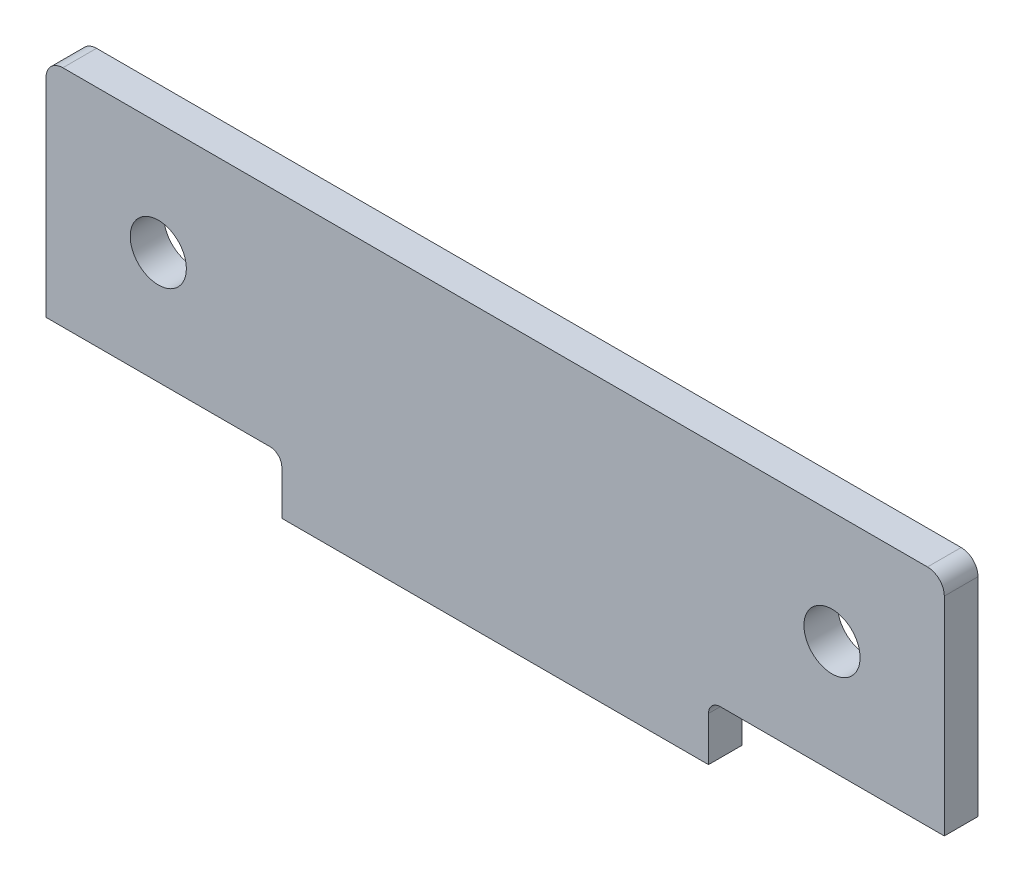
ISO-10303-21;
HEADER;
FILE_DESCRIPTION(('STEP AP214'),'2;1');
FILE_NAME('part.step','',(''),(''),'','','');
FILE_SCHEMA(('AUTOMOTIVE_DESIGN { 1 0 10303 214 1 1 1 1 }'));
ENDSEC;
DATA;
#1=APPLICATION_CONTEXT('core data for automotive mechanical design processes');
#2=APPLICATION_PROTOCOL_DEFINITION('international standard','automotive_design',2000,#1);
#3=PRODUCT_CONTEXT('',#1,'mechanical');
#4=PRODUCT('Part','Part','',(#3));
#5=PRODUCT_RELATED_PRODUCT_CATEGORY('part','',(#4));
#6=PRODUCT_DEFINITION_FORMATION('','',#4);
#7=PRODUCT_DEFINITION_CONTEXT('part definition',#1,'design');
#8=PRODUCT_DEFINITION('design','',#6,#7);
#9=PRODUCT_DEFINITION_SHAPE('','',#8);
#10=(LENGTH_UNIT() NAMED_UNIT(*) SI_UNIT(.MILLI.,.METRE.));
#11=(NAMED_UNIT(*) PLANE_ANGLE_UNIT() SI_UNIT($,.RADIAN.));
#12=(NAMED_UNIT(*) SI_UNIT($,.STERADIAN.) SOLID_ANGLE_UNIT());
#13=UNCERTAINTY_MEASURE_WITH_UNIT(LENGTH_MEASURE(1.E-05),#10,'distance_accuracy_value','');
#14=(GEOMETRIC_REPRESENTATION_CONTEXT(3) GLOBAL_UNCERTAINTY_ASSIGNED_CONTEXT((#13)) GLOBAL_UNIT_ASSIGNED_CONTEXT((#10,
#11,#12)) REPRESENTATION_CONTEXT('',''));
#15=CARTESIAN_POINT('',(0.,0.,0.));
#16=DIRECTION('',(0.,0.,1.));
#17=DIRECTION('',(1.,0.,0.));
#18=AXIS2_PLACEMENT_3D('',#15,#16,#17);
#19=CARTESIAN_POINT('',(0.,0.,3.));
#20=DIRECTION('',(0.,0.,1.));
#21=DIRECTION('',(1.,0.,0.));
#22=AXIS2_PLACEMENT_3D('',#19,#20,#21);
#23=PLANE('',#22);
#24=CARTESIAN_POINT('',(-30.,15.,3.));
#25=DIRECTION('',(0.,0.,1.));
#26=DIRECTION('',(1.,0.,0.));
#27=AXIS2_PLACEMENT_3D('',#24,#25,#26);
#28=CIRCLE('',#27,2.5);
#29=CARTESIAN_POINT('',(-27.5,15.,3.));
#30=VERTEX_POINT('',#29);
#31=EDGE_CURVE('E269',#30,#30,#28,.T.);
#32=ORIENTED_EDGE('',*,*,#31,.F.);
#33=EDGE_LOOP('',(#32));
#34=FACE_BOUND('',#33,.T.);
#35=DIRECTION('',(0.,1.,0.));
#36=VECTOR('',#35,1.);
#37=CARTESIAN_POINT('',(40.,25.,3.));
#38=LINE('',#37,#36);
#39=CARTESIAN_POINT('',(40.,5.,3.));
#40=VERTEX_POINT('',#39);
#41=CARTESIAN_POINT('',(40.,23.5,3.));
#42=VERTEX_POINT('',#41);
#43=EDGE_CURVE('E210',#40,#42,#38,.T.);
#44=ORIENTED_EDGE('',*,*,#43,.T.);
#45=CARTESIAN_POINT('',(38.5,23.5,3.));
#46=DIRECTION('',(0.,0.,1.));
#47=DIRECTION('',(1.,0.,0.));
#48=AXIS2_PLACEMENT_3D('',#45,#46,#47);
#49=CIRCLE('',#48,1.5);
#50=CARTESIAN_POINT('',(38.5,25.,3.));
#51=VERTEX_POINT('',#50);
#52=EDGE_CURVE('E47',#42,#51,#49,.T.);
#53=ORIENTED_EDGE('',*,*,#52,.T.);
#54=DIRECTION('',(-1.,0.,0.));
#55=VECTOR('',#54,1.);
#56=CARTESIAN_POINT('',(40.,25.,3.));
#57=LINE('',#56,#55);
#58=CARTESIAN_POINT('',(-38.5,25.,3.));
#59=VERTEX_POINT('',#58);
#60=EDGE_CURVE('E209',#51,#59,#57,.T.);
#61=ORIENTED_EDGE('',*,*,#60,.T.);
#62=CARTESIAN_POINT('',(-38.5,23.5,3.));
#63=DIRECTION('',(0.,0.,1.));
#64=DIRECTION('',(1.,0.,0.));
#65=AXIS2_PLACEMENT_3D('',#62,#63,#64);
#66=CIRCLE('',#65,1.5);
#67=CARTESIAN_POINT('',(-40.,23.5,3.));
#68=VERTEX_POINT('',#67);
#69=EDGE_CURVE('E54',#59,#68,#66,.T.);
#70=ORIENTED_EDGE('',*,*,#69,.T.);
#71=DIRECTION('',(0.,-1.,0.));
#72=VECTOR('',#71,1.);
#73=CARTESIAN_POINT('',(-40.,25.,3.));
#74=LINE('',#73,#72);
#75=CARTESIAN_POINT('',(-40.,5.,3.));
#76=VERTEX_POINT('',#75);
#77=EDGE_CURVE('E219',#68,#76,#74,.T.);
#78=ORIENTED_EDGE('',*,*,#77,.T.);
#79=DIRECTION('',(1.,0.,0.));
#80=VECTOR('',#79,1.);
#81=CARTESIAN_POINT('',(-40.,5.,3.));
#82=LINE('',#81,#80);
#83=CARTESIAN_POINT('',(-20.05,5.,3.));
#84=VERTEX_POINT('',#83);
#85=EDGE_CURVE('E251',#76,#84,#82,.T.);
#86=ORIENTED_EDGE('',*,*,#85,.T.);
#87=CARTESIAN_POINT('',(-20.05,3.95,3.));
#88=DIRECTION('',(0.,0.,1.));
#89=DIRECTION('',(1.,0.,0.));
#90=AXIS2_PLACEMENT_3D('',#87,#88,#89);
#91=CIRCLE('',#90,1.05);
#92=CARTESIAN_POINT('',(-19.,3.95,3.));
#93=VERTEX_POINT('',#92);
#94=EDGE_CURVE('E137',#84,#93,#91,.F.);
#95=ORIENTED_EDGE('',*,*,#94,.T.);
#96=DIRECTION('',(0.,-1.,0.));
#97=VECTOR('',#96,1.);
#98=CARTESIAN_POINT('',(-19.,5.,3.));
#99=LINE('',#98,#97);
#100=CARTESIAN_POINT('',(-19.,0.,3.));
#101=VERTEX_POINT('',#100);
#102=EDGE_CURVE('E129',#93,#101,#99,.T.);
#103=ORIENTED_EDGE('',*,*,#102,.T.);
#104=DIRECTION('',(1.,0.,0.));
#105=VECTOR('',#104,1.);
#106=CARTESIAN_POINT('',(-19.,0.,3.));
#107=LINE('',#106,#105);
#108=CARTESIAN_POINT('',(19.,0.,3.));
#109=VERTEX_POINT('',#108);
#110=EDGE_CURVE('E133',#101,#109,#107,.T.);
#111=ORIENTED_EDGE('',*,*,#110,.T.);
#112=DIRECTION('',(0.,1.,0.));
#113=VECTOR('',#112,1.);
#114=CARTESIAN_POINT('',(19.,5.,3.));
#115=LINE('',#114,#113);
#116=CARTESIAN_POINT('',(19.,3.95,3.));
#117=VERTEX_POINT('',#116);
#118=EDGE_CURVE('E153',#109,#117,#115,.T.);
#119=ORIENTED_EDGE('',*,*,#118,.T.);
#120=CARTESIAN_POINT('',(20.05,3.95,3.));
#121=DIRECTION('',(0.,0.,1.));
#122=DIRECTION('',(1.,0.,0.));
#123=AXIS2_PLACEMENT_3D('',#120,#121,#122);
#124=CIRCLE('',#123,1.05);
#125=CARTESIAN_POINT('',(20.05,5.,3.));
#126=VERTEX_POINT('',#125);
#127=EDGE_CURVE('E182',#117,#126,#124,.F.);
#128=ORIENTED_EDGE('',*,*,#127,.T.);
#129=DIRECTION('',(1.,0.,0.));
#130=VECTOR('',#129,1.);
#131=CARTESIAN_POINT('',(40.,5.,3.));
#132=LINE('',#131,#130);
#133=EDGE_CURVE('E259',#126,#40,#132,.T.);
#134=ORIENTED_EDGE('',*,*,#133,.T.);
#135=EDGE_LOOP('',(#44,#53,#61,#70,#78,#86,#95,#103,#111,#119,#128,#134));
#136=FACE_BOUND('',#135,.T.);
#137=CARTESIAN_POINT('',(30.,15.,3.));
#138=DIRECTION('',(0.,0.,1.));
#139=DIRECTION('',(-1.,0.,0.));
#140=AXIS2_PLACEMENT_3D('',#137,#138,#139);
#141=CIRCLE('',#140,2.5);
#142=CARTESIAN_POINT('',(27.5,15.,3.));
#143=VERTEX_POINT('',#142);
#144=EDGE_CURVE('E414',#143,#143,#141,.T.);
#145=ORIENTED_EDGE('',*,*,#144,.F.);
#146=EDGE_LOOP('',(#145));
#147=FACE_BOUND('',#146,.T.);
#148=ADVANCED_FACE('F38',(#34,#136,#147),#23,.T.);
#149=CARTESIAN_POINT('',(0.,0.,0.));
#150=DIRECTION('',(0.,0.,1.));
#151=DIRECTION('',(1.,0.,0.));
#152=AXIS2_PLACEMENT_3D('',#149,#150,#151);
#153=PLANE('',#152);
#154=DIRECTION('',(-1.,0.,0.));
#155=VECTOR('',#154,1.);
#156=CARTESIAN_POINT('',(40.,25.,0.));
#157=LINE('',#156,#155);
#158=CARTESIAN_POINT('',(38.5,25.,0.));
#159=VERTEX_POINT('',#158);
#160=CARTESIAN_POINT('',(-38.5,25.,0.));
#161=VERTEX_POINT('',#160);
#162=EDGE_CURVE('E228',#159,#161,#157,.T.);
#163=ORIENTED_EDGE('',*,*,#162,.F.);
#164=CARTESIAN_POINT('',(38.5,23.5,0.));
#165=DIRECTION('',(0.,0.,1.));
#166=DIRECTION('',(1.,0.,0.));
#167=AXIS2_PLACEMENT_3D('',#164,#165,#166);
#168=CIRCLE('',#167,1.5);
#169=CARTESIAN_POINT('',(40.,23.5,0.));
#170=VERTEX_POINT('',#169);
#171=EDGE_CURVE('E200',#159,#170,#168,.F.);
#172=ORIENTED_EDGE('',*,*,#171,.T.);
#173=DIRECTION('',(0.,1.,0.));
#174=VECTOR('',#173,1.);
#175=CARTESIAN_POINT('',(40.,25.,0.));
#176=LINE('',#175,#174);
#177=CARTESIAN_POINT('',(40.,5.,0.));
#178=VERTEX_POINT('',#177);
#179=EDGE_CURVE('E227',#178,#170,#176,.T.);
#180=ORIENTED_EDGE('',*,*,#179,.F.);
#181=DIRECTION('',(1.,0.,0.));
#182=VECTOR('',#181,1.);
#183=CARTESIAN_POINT('',(40.,5.,0.));
#184=LINE('',#183,#182);
#185=CARTESIAN_POINT('',(20.05,5.,0.));
#186=VERTEX_POINT('',#185);
#187=EDGE_CURVE('E233',#186,#178,#184,.T.);
#188=ORIENTED_EDGE('',*,*,#187,.F.);
#189=CARTESIAN_POINT('',(20.05,3.95,0.));
#190=DIRECTION('',(0.,0.,1.));
#191=DIRECTION('',(1.,0.,0.));
#192=AXIS2_PLACEMENT_3D('',#189,#190,#191);
#193=CIRCLE('',#192,1.05);
#194=CARTESIAN_POINT('',(19.,3.95,0.));
#195=VERTEX_POINT('',#194);
#196=EDGE_CURVE('E179',#186,#195,#193,.T.);
#197=ORIENTED_EDGE('',*,*,#196,.T.);
#198=DIRECTION('',(0.,1.,0.));
#199=VECTOR('',#198,1.);
#200=CARTESIAN_POINT('',(19.,5.,0.));
#201=LINE('',#200,#199);
#202=CARTESIAN_POINT('',(19.,0.,0.));
#203=VERTEX_POINT('',#202);
#204=EDGE_CURVE('E239',#203,#195,#201,.T.);
#205=ORIENTED_EDGE('',*,*,#204,.F.);
#206=DIRECTION('',(1.,0.,0.));
#207=VECTOR('',#206,1.);
#208=CARTESIAN_POINT('',(-19.,0.,0.));
#209=LINE('',#208,#207);
#210=CARTESIAN_POINT('',(-19.,0.,0.));
#211=VERTEX_POINT('',#210);
#212=EDGE_CURVE('E268',#211,#203,#209,.T.);
#213=ORIENTED_EDGE('',*,*,#212,.F.);
#214=DIRECTION('',(0.,-1.,0.));
#215=VECTOR('',#214,1.);
#216=CARTESIAN_POINT('',(-19.,5.,0.));
#217=LINE('',#216,#215);
#218=CARTESIAN_POINT('',(-19.,3.95,0.));
#219=VERTEX_POINT('',#218);
#220=EDGE_CURVE('E157',#219,#211,#217,.T.);
#221=ORIENTED_EDGE('',*,*,#220,.F.);
#222=CARTESIAN_POINT('',(-20.05,3.95,0.));
#223=DIRECTION('',(0.,0.,1.));
#224=DIRECTION('',(1.,0.,0.));
#225=AXIS2_PLACEMENT_3D('',#222,#223,#224);
#226=CIRCLE('',#225,1.05);
#227=CARTESIAN_POINT('',(-20.05,5.,0.));
#228=VERTEX_POINT('',#227);
#229=EDGE_CURVE('E185',#219,#228,#226,.T.);
#230=ORIENTED_EDGE('',*,*,#229,.T.);
#231=DIRECTION('',(1.,0.,0.));
#232=VECTOR('',#231,1.);
#233=CARTESIAN_POINT('',(-40.,5.,0.));
#234=LINE('',#233,#232);
#235=CARTESIAN_POINT('',(-40.,5.,0.));
#236=VERTEX_POINT('',#235);
#237=EDGE_CURVE('E143',#236,#228,#234,.T.);
#238=ORIENTED_EDGE('',*,*,#237,.F.);
#239=DIRECTION('',(0.,-1.,0.));
#240=VECTOR('',#239,1.);
#241=CARTESIAN_POINT('',(-40.,25.,0.));
#242=LINE('',#241,#240);
#243=CARTESIAN_POINT('',(-40.,23.5,0.));
#244=VERTEX_POINT('',#243);
#245=EDGE_CURVE('E237',#244,#236,#242,.T.);
#246=ORIENTED_EDGE('',*,*,#245,.F.);
#247=CARTESIAN_POINT('',(-38.5,23.5,0.));
#248=DIRECTION('',(0.,0.,1.));
#249=DIRECTION('',(1.,0.,0.));
#250=AXIS2_PLACEMENT_3D('',#247,#248,#249);
#251=CIRCLE('',#250,1.5);
#252=EDGE_CURVE('E197',#244,#161,#251,.F.);
#253=ORIENTED_EDGE('',*,*,#252,.T.);
#254=EDGE_LOOP('',(#163,#172,#180,#188,#197,#205,#213,#221,#230,#238,#246,#253));
#255=FACE_BOUND('',#254,.T.);
#256=CARTESIAN_POINT('',(-30.,15.,0.));
#257=DIRECTION('',(0.,0.,1.));
#258=DIRECTION('',(1.,0.,0.));
#259=AXIS2_PLACEMENT_3D('',#256,#257,#258);
#260=CIRCLE('',#259,2.5);
#261=CARTESIAN_POINT('',(-27.5,15.,0.));
#262=VERTEX_POINT('',#261);
#263=EDGE_CURVE('E412',#262,#262,#260,.T.);
#264=ORIENTED_EDGE('',*,*,#263,.T.);
#265=EDGE_LOOP('',(#264));
#266=FACE_BOUND('',#265,.T.);
#267=CARTESIAN_POINT('',(30.,15.,0.));
#268=DIRECTION('',(0.,0.,1.));
#269=DIRECTION('',(-1.,0.,0.));
#270=AXIS2_PLACEMENT_3D('',#267,#268,#269);
#271=CIRCLE('',#270,2.5);
#272=CARTESIAN_POINT('',(27.5,15.,0.));
#273=VERTEX_POINT('',#272);
#274=EDGE_CURVE('E420',#273,#273,#271,.T.);
#275=ORIENTED_EDGE('',*,*,#274,.T.);
#276=EDGE_LOOP('',(#275));
#277=FACE_BOUND('',#276,.T.);
#278=ADVANCED_FACE('F224',(#255,#266,#277),#153,.F.);
#279=CARTESIAN_POINT('',(-19.,5.,3.));
#280=DIRECTION('',(1.,0.,0.));
#281=DIRECTION('',(0.,0.,-1.));
#282=AXIS2_PLACEMENT_3D('',#279,#280,#281);
#283=PLANE('',#282);
#284=ORIENTED_EDGE('',*,*,#102,.F.);
#285=DIRECTION('',(0.,0.,-1.));
#286=VECTOR('',#285,1.);
#287=CARTESIAN_POINT('',(-19.,3.95,0.));
#288=LINE('',#287,#286);
#289=EDGE_CURVE('E173',#93,#219,#288,.T.);
#290=ORIENTED_EDGE('',*,*,#289,.T.);
#291=ORIENTED_EDGE('',*,*,#220,.T.);
#292=DIRECTION('',(0.,0.,-1.));
#293=VECTOR('',#292,1.);
#294=CARTESIAN_POINT('',(-19.,0.,3.));
#295=LINE('',#294,#293);
#296=EDGE_CURVE('E148',#101,#211,#295,.T.);
#297=ORIENTED_EDGE('',*,*,#296,.F.);
#298=EDGE_LOOP('',(#284,#290,#291,#297));
#299=FACE_BOUND('',#298,.T.);
#300=ADVANCED_FACE('F155',(#299),#283,.F.);
#301=CARTESIAN_POINT('',(-19.,0.,3.));
#302=DIRECTION('',(0.,1.,0.));
#303=DIRECTION('',(0.,0.,1.));
#304=AXIS2_PLACEMENT_3D('',#301,#302,#303);
#305=PLANE('',#304);
#306=ORIENTED_EDGE('',*,*,#212,.T.);
#307=DIRECTION('',(0.,0.,-1.));
#308=VECTOR('',#307,1.);
#309=CARTESIAN_POINT('',(19.,0.,3.));
#310=LINE('',#309,#308);
#311=EDGE_CURVE('E150',#109,#203,#310,.T.);
#312=ORIENTED_EDGE('',*,*,#311,.F.);
#313=ORIENTED_EDGE('',*,*,#110,.F.);
#314=ORIENTED_EDGE('',*,*,#296,.T.);
#315=EDGE_LOOP('',(#306,#312,#313,#314));
#316=FACE_BOUND('',#315,.T.);
#317=ADVANCED_FACE('F147',(#316),#305,.F.);
#318=CARTESIAN_POINT('',(19.,5.,3.));
#319=DIRECTION('',(-1.,0.,0.));
#320=DIRECTION('',(0.,0.,1.));
#321=AXIS2_PLACEMENT_3D('',#318,#319,#320);
#322=PLANE('',#321);
#323=ORIENTED_EDGE('',*,*,#204,.T.);
#324=DIRECTION('',(0.,0.,-1.));
#325=VECTOR('',#324,1.);
#326=CARTESIAN_POINT('',(19.,3.95,3.));
#327=LINE('',#326,#325);
#328=EDGE_CURVE('E165',#195,#117,#327,.F.);
#329=ORIENTED_EDGE('',*,*,#328,.T.);
#330=ORIENTED_EDGE('',*,*,#118,.F.);
#331=ORIENTED_EDGE('',*,*,#311,.T.);
#332=EDGE_LOOP('',(#323,#329,#330,#331));
#333=FACE_BOUND('',#332,.T.);
#334=ADVANCED_FACE('F276',(#333),#322,.F.);
#335=CARTESIAN_POINT('',(40.,5.,3.));
#336=DIRECTION('',(0.,1.,0.));
#337=DIRECTION('',(0.,0.,1.));
#338=AXIS2_PLACEMENT_3D('',#335,#336,#337);
#339=PLANE('',#338);
#340=ORIENTED_EDGE('',*,*,#133,.F.);
#341=DIRECTION('',(0.,0.,-1.));
#342=VECTOR('',#341,1.);
#343=CARTESIAN_POINT('',(20.05,5.,0.));
#344=LINE('',#343,#342);
#345=EDGE_CURVE('E160',#126,#186,#344,.T.);
#346=ORIENTED_EDGE('',*,*,#345,.T.);
#347=ORIENTED_EDGE('',*,*,#187,.T.);
#348=DIRECTION('',(0.,0.,-1.));
#349=VECTOR('',#348,1.);
#350=CARTESIAN_POINT('',(40.,5.,3.));
#351=LINE('',#350,#349);
#352=EDGE_CURVE('E167',#40,#178,#351,.T.);
#353=ORIENTED_EDGE('',*,*,#352,.F.);
#354=EDGE_LOOP('',(#340,#346,#347,#353));
#355=FACE_BOUND('',#354,.T.);
#356=ADVANCED_FACE('F282',(#355),#339,.F.);
#357=CARTESIAN_POINT('',(40.,25.,3.));
#358=DIRECTION('',(-1.,0.,0.));
#359=DIRECTION('',(0.,-1.,0.));
#360=AXIS2_PLACEMENT_3D('',#357,#358,#359);
#361=PLANE('',#360);
#362=ORIENTED_EDGE('',*,*,#179,.T.);
#363=DIRECTION('',(0.,0.,-1.));
#364=VECTOR('',#363,1.);
#365=CARTESIAN_POINT('',(40.,23.5,3.));
#366=LINE('',#365,#364);
#367=EDGE_CURVE('E62',#170,#42,#366,.F.);
#368=ORIENTED_EDGE('',*,*,#367,.T.);
#369=ORIENTED_EDGE('',*,*,#43,.F.);
#370=ORIENTED_EDGE('',*,*,#352,.T.);
#371=EDGE_LOOP('',(#362,#368,#369,#370));
#372=FACE_BOUND('',#371,.T.);
#373=ADVANCED_FACE('F230',(#372),#361,.F.);
#374=CARTESIAN_POINT('',(40.,25.,3.));
#375=DIRECTION('',(0.,-1.,0.));
#376=DIRECTION('',(0.,0.,-1.));
#377=AXIS2_PLACEMENT_3D('',#374,#375,#376);
#378=PLANE('',#377);
#379=ORIENTED_EDGE('',*,*,#60,.F.);
#380=DIRECTION('',(0.,0.,-1.));
#381=VECTOR('',#380,1.);
#382=CARTESIAN_POINT('',(38.5,25.,3.));
#383=LINE('',#382,#381);
#384=EDGE_CURVE('E193',#51,#159,#383,.T.);
#385=ORIENTED_EDGE('',*,*,#384,.T.);
#386=ORIENTED_EDGE('',*,*,#162,.T.);
#387=DIRECTION('',(0.,0.,-1.));
#388=VECTOR('',#387,1.);
#389=CARTESIAN_POINT('',(-38.5,25.,3.));
#390=LINE('',#389,#388);
#391=EDGE_CURVE('E190',#161,#59,#390,.F.);
#392=ORIENTED_EDGE('',*,*,#391,.T.);
#393=EDGE_LOOP('',(#379,#385,#386,#392));
#394=FACE_BOUND('',#393,.T.);
#395=ADVANCED_FACE('F214',(#394),#378,.F.);
#396=CARTESIAN_POINT('',(-40.,25.,3.));
#397=DIRECTION('',(1.,0.,0.));
#398=DIRECTION('',(0.,1.,0.));
#399=AXIS2_PLACEMENT_3D('',#396,#397,#398);
#400=PLANE('',#399);
#401=ORIENTED_EDGE('',*,*,#77,.F.);
#402=DIRECTION('',(0.,0.,-1.));
#403=VECTOR('',#402,1.);
#404=CARTESIAN_POINT('',(-40.,23.5,3.));
#405=LINE('',#404,#403);
#406=EDGE_CURVE('E11',#68,#244,#405,.T.);
#407=ORIENTED_EDGE('',*,*,#406,.T.);
#408=ORIENTED_EDGE('',*,*,#245,.T.);
#409=DIRECTION('',(0.,0.,-1.));
#410=VECTOR('',#409,1.);
#411=CARTESIAN_POINT('',(-40.,5.,3.));
#412=LINE('',#411,#410);
#413=EDGE_CURVE('E248',#76,#236,#412,.T.);
#414=ORIENTED_EDGE('',*,*,#413,.F.);
#415=EDGE_LOOP('',(#401,#407,#408,#414));
#416=FACE_BOUND('',#415,.T.);
#417=ADVANCED_FACE('F308',(#416),#400,.F.);
#418=CARTESIAN_POINT('',(-40.,5.,3.));
#419=DIRECTION('',(0.,1.,0.));
#420=DIRECTION('',(0.,0.,1.));
#421=AXIS2_PLACEMENT_3D('',#418,#419,#420);
#422=PLANE('',#421);
#423=ORIENTED_EDGE('',*,*,#237,.T.);
#424=DIRECTION('',(0.,0.,-1.));
#425=VECTOR('',#424,1.);
#426=CARTESIAN_POINT('',(-20.05,5.,3.));
#427=LINE('',#426,#425);
#428=EDGE_CURVE('E176',#228,#84,#427,.F.);
#429=ORIENTED_EDGE('',*,*,#428,.T.);
#430=ORIENTED_EDGE('',*,*,#85,.F.);
#431=ORIENTED_EDGE('',*,*,#413,.T.);
#432=EDGE_LOOP('',(#423,#429,#430,#431));
#433=FACE_BOUND('',#432,.T.);
#434=ADVANCED_FACE('F305',(#433),#422,.F.);
#435=CARTESIAN_POINT('',(-30.,15.,3.));
#436=DIRECTION('',(0.,0.,-1.));
#437=DIRECTION('',(-1.,0.,0.));
#438=AXIS2_PLACEMENT_3D('',#435,#436,#437);
#439=CYLINDRICAL_SURFACE('',#438,2.5);
#440=ORIENTED_EDGE('',*,*,#31,.T.);
#441=EDGE_LOOP('',(#440));
#442=FACE_BOUND('',#441,.T.);
#443=ORIENTED_EDGE('',*,*,#263,.F.);
#444=EDGE_LOOP('',(#443));
#445=FACE_BOUND('',#444,.T.);
#446=ADVANCED_FACE('F302',(#442,#445),#439,.F.);
#447=CARTESIAN_POINT('',(30.,15.,3.));
#448=DIRECTION('',(0.,0.,-1.));
#449=DIRECTION('',(-1.,0.,0.));
#450=AXIS2_PLACEMENT_3D('',#447,#448,#449);
#451=CYLINDRICAL_SURFACE('',#450,2.5);
#452=ORIENTED_EDGE('',*,*,#144,.T.);
#453=EDGE_LOOP('',(#452));
#454=FACE_BOUND('',#453,.T.);
#455=ORIENTED_EDGE('',*,*,#274,.F.);
#456=EDGE_LOOP('',(#455));
#457=FACE_BOUND('',#456,.T.);
#458=ADVANCED_FACE('F351',(#454,#457),#451,.F.);
#459=CARTESIAN_POINT('',(20.05,3.95,3.));
#460=DIRECTION('',(0.,0.,1.));
#461=DIRECTION('',(1.,0.,0.));
#462=AXIS2_PLACEMENT_3D('',#459,#460,#461);
#463=CYLINDRICAL_SURFACE('',#462,1.05);
#464=ORIENTED_EDGE('',*,*,#127,.F.);
#465=ORIENTED_EDGE('',*,*,#328,.F.);
#466=ORIENTED_EDGE('',*,*,#196,.F.);
#467=ORIENTED_EDGE('',*,*,#345,.F.);
#468=EDGE_LOOP('',(#464,#465,#466,#467));
#469=FACE_BOUND('',#468,.T.);
#470=ADVANCED_FACE('F278',(#469),#463,.F.);
#471=CARTESIAN_POINT('',(-20.05,3.95,3.));
#472=DIRECTION('',(0.,0.,1.));
#473=DIRECTION('',(1.,0.,0.));
#474=AXIS2_PLACEMENT_3D('',#471,#472,#473);
#475=CYLINDRICAL_SURFACE('',#474,1.05);
#476=ORIENTED_EDGE('',*,*,#94,.F.);
#477=ORIENTED_EDGE('',*,*,#428,.F.);
#478=ORIENTED_EDGE('',*,*,#229,.F.);
#479=ORIENTED_EDGE('',*,*,#289,.F.);
#480=EDGE_LOOP('',(#476,#477,#478,#479));
#481=FACE_BOUND('',#480,.T.);
#482=ADVANCED_FACE('F328',(#481),#475,.F.);
#483=CARTESIAN_POINT('',(38.5,23.5,3.));
#484=DIRECTION('',(0.,0.,-1.));
#485=DIRECTION('',(-1.,0.,0.));
#486=AXIS2_PLACEMENT_3D('',#483,#484,#485);
#487=CYLINDRICAL_SURFACE('',#486,1.5);
#488=ORIENTED_EDGE('',*,*,#52,.F.);
#489=ORIENTED_EDGE('',*,*,#367,.F.);
#490=ORIENTED_EDGE('',*,*,#171,.F.);
#491=ORIENTED_EDGE('',*,*,#384,.F.);
#492=EDGE_LOOP('',(#488,#489,#490,#491));
#493=FACE_BOUND('',#492,.T.);
#494=ADVANCED_FACE('F221',(#493),#487,.T.);
#495=CARTESIAN_POINT('',(-38.5,23.5,3.));
#496=DIRECTION('',(0.,0.,-1.));
#497=DIRECTION('',(-1.,0.,0.));
#498=AXIS2_PLACEMENT_3D('',#495,#496,#497);
#499=CYLINDRICAL_SURFACE('',#498,1.5);
#500=ORIENTED_EDGE('',*,*,#69,.F.);
#501=ORIENTED_EDGE('',*,*,#391,.F.);
#502=ORIENTED_EDGE('',*,*,#252,.F.);
#503=ORIENTED_EDGE('',*,*,#406,.F.);
#504=EDGE_LOOP('',(#500,#501,#502,#503));
#505=FACE_BOUND('',#504,.T.);
#506=ADVANCED_FACE('F40',(#505),#499,.T.);
#507=CLOSED_SHELL('',(#148,#278,#300,#317,#334,#356,#373,#395,#417,#434,#446,#458,#470,#482,
#494,#506));
#508=MANIFOLD_SOLID_BREP('B2',#507);
#509=ADVANCED_BREP_SHAPE_REPRESENTATION('',(#18,#508),#14);
#510=SHAPE_DEFINITION_REPRESENTATION(#9,#509);
ENDSEC;
END-ISO-10303-21;
